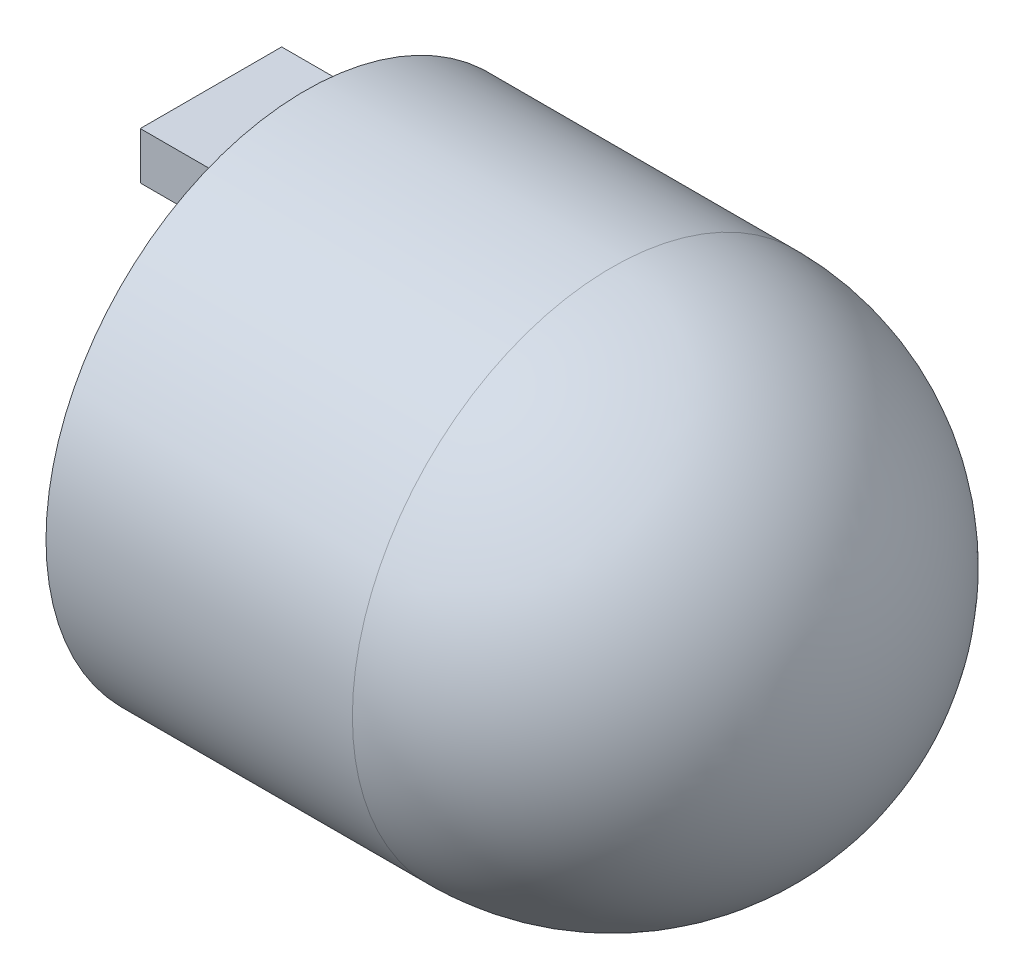
ISO-10303-21;
HEADER;
FILE_DESCRIPTION(('STEP AP214'),'2;1');
FILE_NAME('part.step','',(''),(''),'','','');
FILE_SCHEMA(('AUTOMOTIVE_DESIGN { 1 0 10303 214 1 1 1 1 }'));
ENDSEC;
DATA;
#1=APPLICATION_CONTEXT('core data for automotive mechanical design processes');
#2=APPLICATION_PROTOCOL_DEFINITION('international standard','automotive_design',2000,#1);
#3=PRODUCT_CONTEXT('',#1,'mechanical');
#4=PRODUCT('Part','Part','',(#3));
#5=PRODUCT_RELATED_PRODUCT_CATEGORY('part','',(#4));
#6=PRODUCT_DEFINITION_FORMATION('','',#4);
#7=PRODUCT_DEFINITION_CONTEXT('part definition',#1,'design');
#8=PRODUCT_DEFINITION('design','',#6,#7);
#9=PRODUCT_DEFINITION_SHAPE('','',#8);
#10=(LENGTH_UNIT() NAMED_UNIT(*) SI_UNIT(.MILLI.,.METRE.));
#11=(NAMED_UNIT(*) PLANE_ANGLE_UNIT() SI_UNIT($,.RADIAN.));
#12=(NAMED_UNIT(*) SI_UNIT($,.STERADIAN.) SOLID_ANGLE_UNIT());
#13=UNCERTAINTY_MEASURE_WITH_UNIT(LENGTH_MEASURE(1.E-05),#10,'distance_accuracy_value','');
#14=(GEOMETRIC_REPRESENTATION_CONTEXT(3) GLOBAL_UNCERTAINTY_ASSIGNED_CONTEXT((#13)) GLOBAL_UNIT_ASSIGNED_CONTEXT((#10,
#11,#12)) REPRESENTATION_CONTEXT('',''));
#15=CARTESIAN_POINT('',(0.,0.,0.));
#16=DIRECTION('',(0.,0.,1.));
#17=DIRECTION('',(1.,0.,0.));
#18=AXIS2_PLACEMENT_3D('',#15,#16,#17);
#19=CARTESIAN_POINT('',(0.,0.,0.));
#20=DIRECTION('',(-1.,0.,0.));
#21=DIRECTION('',(0.,0.,1.));
#22=AXIS2_PLACEMENT_3D('',#19,#20,#21);
#23=PLANE('',#22);
#24=CARTESIAN_POINT('',(0.,0.,0.));
#25=DIRECTION('',(-1.,0.,0.));
#26=DIRECTION('',(0.,0.,1.));
#27=AXIS2_PLACEMENT_3D('',#24,#25,#26);
#28=CIRCLE('',#27,5.5);
#29=CARTESIAN_POINT('',(0.,0.,5.5));
#30=VERTEX_POINT('',#29);
#31=EDGE_CURVE('E11',#30,#30,#28,.T.);
#32=ORIENTED_EDGE('',*,*,#31,.T.);
#33=EDGE_LOOP('',(#32));
#34=FACE_BOUND('',#33,.T.);
#35=DIRECTION('',(0.,0.,1.));
#36=VECTOR('',#35,1.);
#37=CARTESIAN_POINT('',(0.,-4.552,-1.5));
#38=LINE('',#37,#36);
#39=CARTESIAN_POINT('',(0.,-4.552,-1.5));
#40=VERTEX_POINT('',#39);
#41=CARTESIAN_POINT('',(0.,-4.552,1.5));
#42=VERTEX_POINT('',#41);
#43=EDGE_CURVE('E270',#40,#42,#38,.T.);
#44=ORIENTED_EDGE('',*,*,#43,.F.);
#45=DIRECTION('',(0.,-1.,0.));
#46=VECTOR('',#45,1.);
#47=CARTESIAN_POINT('',(0.,-3.552,-1.5));
#48=LINE('',#47,#46);
#49=CARTESIAN_POINT('',(0.,-3.552,-1.5));
#50=VERTEX_POINT('',#49);
#51=EDGE_CURVE('E161',#50,#40,#48,.T.);
#52=ORIENTED_EDGE('',*,*,#51,.F.);
#53=DIRECTION('',(0.,0.,1.));
#54=VECTOR('',#53,1.);
#55=CARTESIAN_POINT('',(0.,-3.552,-2.05074815616155));
#56=LINE('',#55,#54);
#57=CARTESIAN_POINT('',(0.,-3.552,-2.05074815616155));
#58=VERTEX_POINT('',#57);
#59=EDGE_CURVE('E227',#58,#50,#56,.T.);
#60=ORIENTED_EDGE('',*,*,#59,.F.);
#61=DIRECTION('',(0.,-0.866025403784439,0.5));
#62=VECTOR('',#61,1.);
#63=CARTESIAN_POINT('',(0.,0.,-4.1014963123231));
#64=LINE('',#63,#62);
#65=CARTESIAN_POINT('',(0.,0.,-4.1014963123231));
#66=VERTEX_POINT('',#65);
#67=EDGE_CURVE('E223',#66,#58,#64,.T.);
#68=ORIENTED_EDGE('',*,*,#67,.F.);
#69=DIRECTION('',(0.,-0.866025403784439,-0.5));
#70=VECTOR('',#69,1.);
#71=CARTESIAN_POINT('',(0.,3.552,-2.05074815616155));
#72=LINE('',#71,#70);
#73=CARTESIAN_POINT('',(0.,3.552,-2.05074815616155));
#74=VERTEX_POINT('',#73);
#75=EDGE_CURVE('E220',#74,#66,#72,.T.);
#76=ORIENTED_EDGE('',*,*,#75,.F.);
#77=DIRECTION('',(0.,0.,-1.));
#78=VECTOR('',#77,1.);
#79=CARTESIAN_POINT('',(0.,3.552,2.05074815616155));
#80=LINE('',#79,#78);
#81=CARTESIAN_POINT('',(0.,3.552,-1.5));
#82=VERTEX_POINT('',#81);
#83=EDGE_CURVE('E216',#82,#74,#80,.T.);
#84=ORIENTED_EDGE('',*,*,#83,.F.);
#85=DIRECTION('',(0.,-1.,0.));
#86=VECTOR('',#85,1.);
#87=CARTESIAN_POINT('',(0.,3.552,-1.5));
#88=LINE('',#87,#86);
#89=CARTESIAN_POINT('',(0.,4.552,-1.5));
#90=VERTEX_POINT('',#89);
#91=EDGE_CURVE('E61',#90,#82,#88,.T.);
#92=ORIENTED_EDGE('',*,*,#91,.F.);
#93=DIRECTION('',(0.,0.,-1.));
#94=VECTOR('',#93,1.);
#95=CARTESIAN_POINT('',(0.,4.552,-1.5));
#96=LINE('',#95,#94);
#97=CARTESIAN_POINT('',(0.,4.552,1.5));
#98=VERTEX_POINT('',#97);
#99=EDGE_CURVE('E173',#98,#90,#96,.T.);
#100=ORIENTED_EDGE('',*,*,#99,.F.);
#101=DIRECTION('',(0.,1.,0.));
#102=VECTOR('',#101,1.);
#103=CARTESIAN_POINT('',(0.,3.552,1.5));
#104=LINE('',#103,#102);
#105=CARTESIAN_POINT('',(0.,3.552,1.5));
#106=VERTEX_POINT('',#105);
#107=EDGE_CURVE('E164',#106,#98,#104,.T.);
#108=ORIENTED_EDGE('',*,*,#107,.F.);
#109=CARTESIAN_POINT('',(0.,3.552,2.05074815616155));
#110=VERTEX_POINT('',#109);
#111=EDGE_CURVE('E217',#110,#106,#80,.T.);
#112=ORIENTED_EDGE('',*,*,#111,.F.);
#113=DIRECTION('',(0.,0.866025403784438,-0.5));
#114=VECTOR('',#113,1.);
#115=CARTESIAN_POINT('',(0.,0.,4.1014963123231));
#116=LINE('',#115,#114);
#117=CARTESIAN_POINT('',(0.,0.,4.1014963123231));
#118=VERTEX_POINT('',#117);
#119=EDGE_CURVE('E194',#118,#110,#116,.T.);
#120=ORIENTED_EDGE('',*,*,#119,.F.);
#121=DIRECTION('',(0.,0.866025403784439,0.5));
#122=VECTOR('',#121,1.);
#123=CARTESIAN_POINT('',(0.,-3.552,2.05074815616155));
#124=LINE('',#123,#122);
#125=CARTESIAN_POINT('',(0.,-3.552,2.05074815616155));
#126=VERTEX_POINT('',#125);
#127=EDGE_CURVE('E199',#126,#118,#124,.T.);
#128=ORIENTED_EDGE('',*,*,#127,.F.);
#129=CARTESIAN_POINT('',(0.,-3.552,1.5));
#130=VERTEX_POINT('',#129);
#131=EDGE_CURVE('E226',#130,#126,#56,.T.);
#132=ORIENTED_EDGE('',*,*,#131,.F.);
#133=DIRECTION('',(0.,1.,0.));
#134=VECTOR('',#133,1.);
#135=CARTESIAN_POINT('',(0.,-3.552,1.5));
#136=LINE('',#135,#134);
#137=EDGE_CURVE('E157',#42,#130,#136,.T.);
#138=ORIENTED_EDGE('',*,*,#137,.F.);
#139=EDGE_LOOP('',(#44,#52,#60,#68,#76,#84,#92,#100,#108,#112,#120,#128,#132,#138));
#140=FACE_BOUND('',#139,.T.);
#141=ADVANCED_FACE('F39',(#34,#140),#23,.T.);
#142=CARTESIAN_POINT('',(0.,0.,0.));
#143=DIRECTION('',(-1.,0.,0.));
#144=DIRECTION('',(0.,0.,1.));
#145=AXIS2_PLACEMENT_3D('',#142,#143,#144);
#146=CYLINDRICAL_SURFACE('',#145,5.5);
#147=CARTESIAN_POINT('',(6.5,0.,0.));
#148=DIRECTION('',(-1.,0.,0.));
#149=DIRECTION('',(0.,0.,1.));
#150=AXIS2_PLACEMENT_3D('',#147,#148,#149);
#151=CIRCLE('',#150,5.5);
#152=CARTESIAN_POINT('',(6.5,0.,5.5));
#153=VERTEX_POINT('',#152);
#154=EDGE_CURVE('E46',#153,#153,#151,.T.);
#155=ORIENTED_EDGE('',*,*,#154,.T.);
#156=EDGE_LOOP('',(#155));
#157=FACE_BOUND('',#156,.T.);
#158=ORIENTED_EDGE('',*,*,#31,.F.);
#159=EDGE_LOOP('',(#158));
#160=FACE_BOUND('',#159,.T.);
#161=ADVANCED_FACE('F248',(#157,#160),#146,.T.);
#162=CARTESIAN_POINT('',(6.5,0.,0.));
#163=DIRECTION('',(-1.,0.,0.));
#164=DIRECTION('',(0.,-1.,0.));
#165=AXIS2_PLACEMENT_3D('',#162,#163,#164);
#166=SPHERICAL_SURFACE('',#165,5.5);
#167=ORIENTED_EDGE('',*,*,#154,.F.);
#168=EDGE_LOOP('',(#167));
#169=FACE_BOUND('',#168,.T.);
#170=ADVANCED_FACE('F251',(#169),#166,.T.);
#171=CARTESIAN_POINT('',(2.75,0.,4.1014963123231));
#172=DIRECTION('',(0.,0.5,0.866025403784438));
#173=DIRECTION('',(0.,-0.866025403784438,0.5));
#174=AXIS2_PLACEMENT_3D('',#171,#172,#173);
#175=PLANE('',#174);
#176=ORIENTED_EDGE('',*,*,#119,.T.);
#177=DIRECTION('',(-1.,0.,0.));
#178=VECTOR('',#177,1.);
#179=CARTESIAN_POINT('',(2.75,3.552,2.05074815616155));
#180=LINE('',#179,#178);
#181=CARTESIAN_POINT('',(2.75,3.552,2.05074815616155));
#182=VERTEX_POINT('',#181);
#183=EDGE_CURVE('E214',#182,#110,#180,.T.);
#184=ORIENTED_EDGE('',*,*,#183,.F.);
#185=DIRECTION('',(0.,0.866025403784438,-0.5));
#186=VECTOR('',#185,1.);
#187=CARTESIAN_POINT('',(2.75,0.,4.1014963123231));
#188=LINE('',#187,#186);
#189=CARTESIAN_POINT('',(2.75,0.,4.1014963123231));
#190=VERTEX_POINT('',#189);
#191=EDGE_CURVE('E195',#190,#182,#188,.T.);
#192=ORIENTED_EDGE('',*,*,#191,.F.);
#193=DIRECTION('',(-1.,0.,0.));
#194=VECTOR('',#193,1.);
#195=CARTESIAN_POINT('',(2.75,0.,4.1014963123231));
#196=LINE('',#195,#194);
#197=EDGE_CURVE('E232',#190,#118,#196,.T.);
#198=ORIENTED_EDGE('',*,*,#197,.T.);
#199=EDGE_LOOP('',(#176,#184,#192,#198));
#200=FACE_BOUND('',#199,.T.);
#201=ADVANCED_FACE('F253',(#200),#175,.F.);
#202=CARTESIAN_POINT('',(2.75,-3.552,2.05074815616155));
#203=DIRECTION('',(0.,-0.5,0.866025403784439));
#204=DIRECTION('',(0.,-0.866025403784439,-0.5));
#205=AXIS2_PLACEMENT_3D('',#202,#203,#204);
#206=PLANE('',#205);
#207=ORIENTED_EDGE('',*,*,#127,.T.);
#208=ORIENTED_EDGE('',*,*,#197,.F.);
#209=DIRECTION('',(0.,0.866025403784439,0.5));
#210=VECTOR('',#209,1.);
#211=CARTESIAN_POINT('',(2.75,-3.552,2.05074815616155));
#212=LINE('',#211,#210);
#213=CARTESIAN_POINT('',(2.75,-3.552,2.05074815616155));
#214=VERTEX_POINT('',#213);
#215=EDGE_CURVE('E211',#214,#190,#212,.T.);
#216=ORIENTED_EDGE('',*,*,#215,.F.);
#217=DIRECTION('',(-1.,0.,0.));
#218=VECTOR('',#217,1.);
#219=CARTESIAN_POINT('',(2.75,-3.552,2.05074815616155));
#220=LINE('',#219,#218);
#221=EDGE_CURVE('E234',#214,#126,#220,.T.);
#222=ORIENTED_EDGE('',*,*,#221,.T.);
#223=EDGE_LOOP('',(#207,#208,#216,#222));
#224=FACE_BOUND('',#223,.T.);
#225=ADVANCED_FACE('F259',(#224),#206,.F.);
#226=CARTESIAN_POINT('',(2.75,-3.552,-2.05074815616155));
#227=DIRECTION('',(0.,-1.,0.));
#228=DIRECTION('',(0.,0.,-1.));
#229=AXIS2_PLACEMENT_3D('',#226,#227,#228);
#230=PLANE('',#229);
#231=ORIENTED_EDGE('',*,*,#59,.T.);
#232=DIRECTION('',(1.,0.,0.));
#233=VECTOR('',#232,1.);
#234=CARTESIAN_POINT('',(-2.,-3.552,-1.5));
#235=LINE('',#234,#233);
#236=CARTESIAN_POINT('',(-2.,-3.552,-1.5));
#237=VERTEX_POINT('',#236);
#238=EDGE_CURVE('E278',#237,#50,#235,.T.);
#239=ORIENTED_EDGE('',*,*,#238,.F.);
#240=DIRECTION('',(0.,0.,-1.));
#241=VECTOR('',#240,1.);
#242=CARTESIAN_POINT('',(-2.,-3.552,-1.5));
#243=LINE('',#242,#241);
#244=CARTESIAN_POINT('',(-2.,-3.552,1.5));
#245=VERTEX_POINT('',#244);
#246=EDGE_CURVE('E154',#245,#237,#243,.T.);
#247=ORIENTED_EDGE('',*,*,#246,.F.);
#248=DIRECTION('',(1.,0.,0.));
#249=VECTOR('',#248,1.);
#250=CARTESIAN_POINT('',(-2.,-3.552,1.5));
#251=LINE('',#250,#249);
#252=EDGE_CURVE('E53',#245,#130,#251,.T.);
#253=ORIENTED_EDGE('',*,*,#252,.T.);
#254=ORIENTED_EDGE('',*,*,#131,.T.);
#255=ORIENTED_EDGE('',*,*,#221,.F.);
#256=DIRECTION('',(0.,0.,1.));
#257=VECTOR('',#256,1.);
#258=CARTESIAN_POINT('',(2.75,-3.552,-2.05074815616155));
#259=LINE('',#258,#257);
#260=CARTESIAN_POINT('',(2.75,-3.552,-2.05074815616155));
#261=VERTEX_POINT('',#260);
#262=EDGE_CURVE('E208',#261,#214,#259,.T.);
#263=ORIENTED_EDGE('',*,*,#262,.F.);
#264=DIRECTION('',(-1.,0.,0.));
#265=VECTOR('',#264,1.);
#266=CARTESIAN_POINT('',(2.75,-3.552,-2.05074815616155));
#267=LINE('',#266,#265);
#268=EDGE_CURVE('E237',#261,#58,#267,.T.);
#269=ORIENTED_EDGE('',*,*,#268,.T.);
#270=EDGE_LOOP('',(#231,#239,#247,#253,#254,#255,#263,#269));
#271=FACE_BOUND('',#270,.T.);
#272=ADVANCED_FACE('F282',(#271),#230,.F.);
#273=CARTESIAN_POINT('',(2.75,0.,-4.1014963123231));
#274=DIRECTION('',(0.,-0.5,-0.866025403784438));
#275=DIRECTION('',(0.,0.866025403784439,-0.5));
#276=AXIS2_PLACEMENT_3D('',#273,#274,#275);
#277=PLANE('',#276);
#278=ORIENTED_EDGE('',*,*,#67,.T.);
#279=ORIENTED_EDGE('',*,*,#268,.F.);
#280=DIRECTION('',(0.,-0.866025403784439,0.5));
#281=VECTOR('',#280,1.);
#282=CARTESIAN_POINT('',(2.75,0.,-4.1014963123231));
#283=LINE('',#282,#281);
#284=CARTESIAN_POINT('',(2.75,0.,-4.1014963123231));
#285=VERTEX_POINT('',#284);
#286=EDGE_CURVE('E205',#285,#261,#283,.T.);
#287=ORIENTED_EDGE('',*,*,#286,.F.);
#288=DIRECTION('',(-1.,0.,0.));
#289=VECTOR('',#288,1.);
#290=CARTESIAN_POINT('',(2.75,0.,-4.1014963123231));
#291=LINE('',#290,#289);
#292=EDGE_CURVE('E239',#285,#66,#291,.T.);
#293=ORIENTED_EDGE('',*,*,#292,.T.);
#294=EDGE_LOOP('',(#278,#279,#287,#293));
#295=FACE_BOUND('',#294,.T.);
#296=ADVANCED_FACE('F287',(#295),#277,.F.);
#297=CARTESIAN_POINT('',(2.75,3.552,-2.05074815616155));
#298=DIRECTION('',(0.,0.5,-0.866025403784439));
#299=DIRECTION('',(0.,0.866025403784439,0.5));
#300=AXIS2_PLACEMENT_3D('',#297,#298,#299);
#301=PLANE('',#300);
#302=ORIENTED_EDGE('',*,*,#75,.T.);
#303=ORIENTED_EDGE('',*,*,#292,.F.);
#304=DIRECTION('',(0.,-0.866025403784439,-0.5));
#305=VECTOR('',#304,1.);
#306=CARTESIAN_POINT('',(2.75,3.552,-2.05074815616155));
#307=LINE('',#306,#305);
#308=CARTESIAN_POINT('',(2.75,3.552,-2.05074815616155));
#309=VERTEX_POINT('',#308);
#310=EDGE_CURVE('E202',#309,#285,#307,.T.);
#311=ORIENTED_EDGE('',*,*,#310,.F.);
#312=DIRECTION('',(-1.,0.,0.));
#313=VECTOR('',#312,1.);
#314=CARTESIAN_POINT('',(2.75,3.552,-2.05074815616155));
#315=LINE('',#314,#313);
#316=EDGE_CURVE('E241',#309,#74,#315,.T.);
#317=ORIENTED_EDGE('',*,*,#316,.T.);
#318=EDGE_LOOP('',(#302,#303,#311,#317));
#319=FACE_BOUND('',#318,.T.);
#320=ADVANCED_FACE('F291',(#319),#301,.F.);
#321=CARTESIAN_POINT('',(2.75,3.552,2.05074815616155));
#322=DIRECTION('',(0.,1.,0.));
#323=DIRECTION('',(0.,0.,1.));
#324=AXIS2_PLACEMENT_3D('',#321,#322,#323);
#325=PLANE('',#324);
#326=ORIENTED_EDGE('',*,*,#111,.T.);
#327=DIRECTION('',(1.,0.,0.));
#328=VECTOR('',#327,1.);
#329=CARTESIAN_POINT('',(-2.,3.552,1.5));
#330=LINE('',#329,#328);
#331=CARTESIAN_POINT('',(-2.,3.552,1.5));
#332=VERTEX_POINT('',#331);
#333=EDGE_CURVE('E188',#332,#106,#330,.T.);
#334=ORIENTED_EDGE('',*,*,#333,.F.);
#335=DIRECTION('',(0.,0.,1.));
#336=VECTOR('',#335,1.);
#337=CARTESIAN_POINT('',(-2.,3.552,-1.5));
#338=LINE('',#337,#336);
#339=CARTESIAN_POINT('',(-2.,3.552,-1.5));
#340=VERTEX_POINT('',#339);
#341=EDGE_CURVE('E172',#340,#332,#338,.T.);
#342=ORIENTED_EDGE('',*,*,#341,.F.);
#343=DIRECTION('',(1.,0.,0.));
#344=VECTOR('',#343,1.);
#345=CARTESIAN_POINT('',(-2.,3.552,-1.5));
#346=LINE('',#345,#344);
#347=EDGE_CURVE('E191',#340,#82,#346,.T.);
#348=ORIENTED_EDGE('',*,*,#347,.T.);
#349=ORIENTED_EDGE('',*,*,#83,.T.);
#350=ORIENTED_EDGE('',*,*,#316,.F.);
#351=DIRECTION('',(0.,0.,-1.));
#352=VECTOR('',#351,1.);
#353=CARTESIAN_POINT('',(2.75,3.552,2.05074815616155));
#354=LINE('',#353,#352);
#355=EDGE_CURVE('E198',#182,#309,#354,.T.);
#356=ORIENTED_EDGE('',*,*,#355,.F.);
#357=ORIENTED_EDGE('',*,*,#183,.T.);
#358=EDGE_LOOP('',(#326,#334,#342,#348,#349,#350,#356,#357));
#359=FACE_BOUND('',#358,.T.);
#360=ADVANCED_FACE('F294',(#359),#325,.F.);
#361=CARTESIAN_POINT('',(2.75,0.,0.));
#362=DIRECTION('',(-1.,0.,0.));
#363=DIRECTION('',(0.,0.,1.));
#364=AXIS2_PLACEMENT_3D('',#361,#362,#363);
#365=PLANE('',#364);
#366=ORIENTED_EDGE('',*,*,#191,.T.);
#367=ORIENTED_EDGE('',*,*,#355,.T.);
#368=ORIENTED_EDGE('',*,*,#310,.T.);
#369=ORIENTED_EDGE('',*,*,#286,.T.);
#370=ORIENTED_EDGE('',*,*,#262,.T.);
#371=ORIENTED_EDGE('',*,*,#215,.T.);
#372=EDGE_LOOP('',(#366,#367,#368,#369,#370,#371));
#373=FACE_BOUND('',#372,.T.);
#374=ADVANCED_FACE('F315',(#373),#365,.T.);
#375=CARTESIAN_POINT('',(-2.,3.552,-1.5));
#376=DIRECTION('',(0.,0.,1.));
#377=DIRECTION('',(1.,0.,0.));
#378=AXIS2_PLACEMENT_3D('',#375,#376,#377);
#379=PLANE('',#378);
#380=ORIENTED_EDGE('',*,*,#91,.T.);
#381=ORIENTED_EDGE('',*,*,#347,.F.);
#382=DIRECTION('',(0.,-1.,0.));
#383=VECTOR('',#382,1.);
#384=CARTESIAN_POINT('',(-2.,3.552,-1.5));
#385=LINE('',#384,#383);
#386=CARTESIAN_POINT('',(-2.,4.552,-1.5));
#387=VERTEX_POINT('',#386);
#388=EDGE_CURVE('E169',#387,#340,#385,.T.);
#389=ORIENTED_EDGE('',*,*,#388,.F.);
#390=DIRECTION('',(1.,0.,0.));
#391=VECTOR('',#390,1.);
#392=CARTESIAN_POINT('',(-2.,4.552,-1.5));
#393=LINE('',#392,#391);
#394=EDGE_CURVE('E178',#387,#90,#393,.T.);
#395=ORIENTED_EDGE('',*,*,#394,.T.);
#396=EDGE_LOOP('',(#380,#381,#389,#395));
#397=FACE_BOUND('',#396,.T.);
#398=ADVANCED_FACE('F299',(#397),#379,.F.);
#399=CARTESIAN_POINT('',(-2.,3.552,1.5));
#400=DIRECTION('',(0.,0.,-1.));
#401=DIRECTION('',(-1.,0.,0.));
#402=AXIS2_PLACEMENT_3D('',#399,#400,#401);
#403=PLANE('',#402);
#404=ORIENTED_EDGE('',*,*,#107,.T.);
#405=DIRECTION('',(1.,0.,0.));
#406=VECTOR('',#405,1.);
#407=CARTESIAN_POINT('',(-2.,4.552,1.5));
#408=LINE('',#407,#406);
#409=CARTESIAN_POINT('',(-2.,4.552,1.5));
#410=VERTEX_POINT('',#409);
#411=EDGE_CURVE('E185',#410,#98,#408,.T.);
#412=ORIENTED_EDGE('',*,*,#411,.F.);
#413=DIRECTION('',(0.,1.,0.));
#414=VECTOR('',#413,1.);
#415=CARTESIAN_POINT('',(-2.,3.552,1.5));
#416=LINE('',#415,#414);
#417=EDGE_CURVE('E175',#332,#410,#416,.T.);
#418=ORIENTED_EDGE('',*,*,#417,.F.);
#419=ORIENTED_EDGE('',*,*,#333,.T.);
#420=EDGE_LOOP('',(#404,#412,#418,#419));
#421=FACE_BOUND('',#420,.T.);
#422=ADVANCED_FACE('F307',(#421),#403,.F.);
#423=CARTESIAN_POINT('',(-2.,4.552,-1.5));
#424=DIRECTION('',(0.,-1.,0.));
#425=DIRECTION('',(0.,0.,-1.));
#426=AXIS2_PLACEMENT_3D('',#423,#424,#425);
#427=PLANE('',#426);
#428=ORIENTED_EDGE('',*,*,#99,.T.);
#429=ORIENTED_EDGE('',*,*,#394,.F.);
#430=DIRECTION('',(0.,0.,-1.));
#431=VECTOR('',#430,1.);
#432=CARTESIAN_POINT('',(-2.,4.552,-1.5));
#433=LINE('',#432,#431);
#434=EDGE_CURVE('E177',#410,#387,#433,.T.);
#435=ORIENTED_EDGE('',*,*,#434,.F.);
#436=ORIENTED_EDGE('',*,*,#411,.T.);
#437=EDGE_LOOP('',(#428,#429,#435,#436));
#438=FACE_BOUND('',#437,.T.);
#439=ADVANCED_FACE('F303',(#438),#427,.F.);
#440=CARTESIAN_POINT('',(-2.,0.,0.));
#441=DIRECTION('',(1.,0.,0.));
#442=DIRECTION('',(0.,0.,-1.));
#443=AXIS2_PLACEMENT_3D('',#440,#441,#442);
#444=PLANE('',#443);
#445=ORIENTED_EDGE('',*,*,#388,.T.);
#446=ORIENTED_EDGE('',*,*,#341,.T.);
#447=ORIENTED_EDGE('',*,*,#417,.T.);
#448=ORIENTED_EDGE('',*,*,#434,.T.);
#449=EDGE_LOOP('',(#445,#446,#447,#448));
#450=FACE_BOUND('',#449,.T.);
#451=ADVANCED_FACE('F383',(#450),#444,.F.);
#452=CARTESIAN_POINT('',(-2.,-3.552,-1.5));
#453=DIRECTION('',(0.,0.,1.));
#454=DIRECTION('',(1.,0.,0.));
#455=AXIS2_PLACEMENT_3D('',#452,#453,#454);
#456=PLANE('',#455);
#457=ORIENTED_EDGE('',*,*,#51,.T.);
#458=DIRECTION('',(1.,0.,0.));
#459=VECTOR('',#458,1.);
#460=CARTESIAN_POINT('',(-2.,-4.552,-1.5));
#461=LINE('',#460,#459);
#462=CARTESIAN_POINT('',(-2.,-4.552,-1.5));
#463=VERTEX_POINT('',#462);
#464=EDGE_CURVE('E143',#463,#40,#461,.T.);
#465=ORIENTED_EDGE('',*,*,#464,.F.);
#466=DIRECTION('',(0.,-1.,0.));
#467=VECTOR('',#466,1.);
#468=CARTESIAN_POINT('',(-2.,-3.552,-1.5));
#469=LINE('',#468,#467);
#470=EDGE_CURVE('E150',#237,#463,#469,.T.);
#471=ORIENTED_EDGE('',*,*,#470,.F.);
#472=ORIENTED_EDGE('',*,*,#238,.T.);
#473=EDGE_LOOP('',(#457,#465,#471,#472));
#474=FACE_BOUND('',#473,.T.);
#475=ADVANCED_FACE('F159',(#474),#456,.F.);
#476=CARTESIAN_POINT('',(-2.,-4.552,-1.5));
#477=DIRECTION('',(0.,1.,0.));
#478=DIRECTION('',(0.,0.,1.));
#479=AXIS2_PLACEMENT_3D('',#476,#477,#478);
#480=PLANE('',#479);
#481=ORIENTED_EDGE('',*,*,#43,.T.);
#482=DIRECTION('',(1.,0.,0.));
#483=VECTOR('',#482,1.);
#484=CARTESIAN_POINT('',(-2.,-4.552,1.5));
#485=LINE('',#484,#483);
#486=CARTESIAN_POINT('',(-2.,-4.552,1.5));
#487=VERTEX_POINT('',#486);
#488=EDGE_CURVE('E146',#487,#42,#485,.T.);
#489=ORIENTED_EDGE('',*,*,#488,.F.);
#490=DIRECTION('',(0.,0.,1.));
#491=VECTOR('',#490,1.);
#492=CARTESIAN_POINT('',(-2.,-4.552,-1.5));
#493=LINE('',#492,#491);
#494=EDGE_CURVE('E139',#463,#487,#493,.T.);
#495=ORIENTED_EDGE('',*,*,#494,.F.);
#496=ORIENTED_EDGE('',*,*,#464,.T.);
#497=EDGE_LOOP('',(#481,#489,#495,#496));
#498=FACE_BOUND('',#497,.T.);
#499=ADVANCED_FACE('F141',(#498),#480,.F.);
#500=CARTESIAN_POINT('',(-2.,-3.552,1.5));
#501=DIRECTION('',(0.,0.,-1.));
#502=DIRECTION('',(0.,1.,0.));
#503=AXIS2_PLACEMENT_3D('',#500,#501,#502);
#504=PLANE('',#503);
#505=ORIENTED_EDGE('',*,*,#137,.T.);
#506=ORIENTED_EDGE('',*,*,#252,.F.);
#507=DIRECTION('',(0.,1.,0.));
#508=VECTOR('',#507,1.);
#509=CARTESIAN_POINT('',(-2.,-3.552,1.5));
#510=LINE('',#509,#508);
#511=EDGE_CURVE('E149',#487,#245,#510,.T.);
#512=ORIENTED_EDGE('',*,*,#511,.F.);
#513=ORIENTED_EDGE('',*,*,#488,.T.);
#514=EDGE_LOOP('',(#505,#506,#512,#513));
#515=FACE_BOUND('',#514,.T.);
#516=ADVANCED_FACE('F281',(#515),#504,.F.);
#517=CARTESIAN_POINT('',(-2.,0.,0.));
#518=DIRECTION('',(-1.,0.,0.));
#519=DIRECTION('',(0.,0.,1.));
#520=AXIS2_PLACEMENT_3D('',#517,#518,#519);
#521=PLANE('',#520);
#522=ORIENTED_EDGE('',*,*,#470,.T.);
#523=ORIENTED_EDGE('',*,*,#494,.T.);
#524=ORIENTED_EDGE('',*,*,#511,.T.);
#525=ORIENTED_EDGE('',*,*,#246,.T.);
#526=EDGE_LOOP('',(#522,#523,#524,#525));
#527=FACE_BOUND('',#526,.T.);
#528=ADVANCED_FACE('F153',(#527),#521,.T.);
#529=CLOSED_SHELL('',(#141,#161,#170,#201,#225,#272,#296,#320,#360,#374,#398,#422,#439,#451,
#475,#499,#516,#528));
#530=MANIFOLD_SOLID_BREP('B2',#529);
#531=ADVANCED_BREP_SHAPE_REPRESENTATION('',(#18,#530),#14);
#532=SHAPE_DEFINITION_REPRESENTATION(#9,#531);
ENDSEC;
END-ISO-10303-21;
